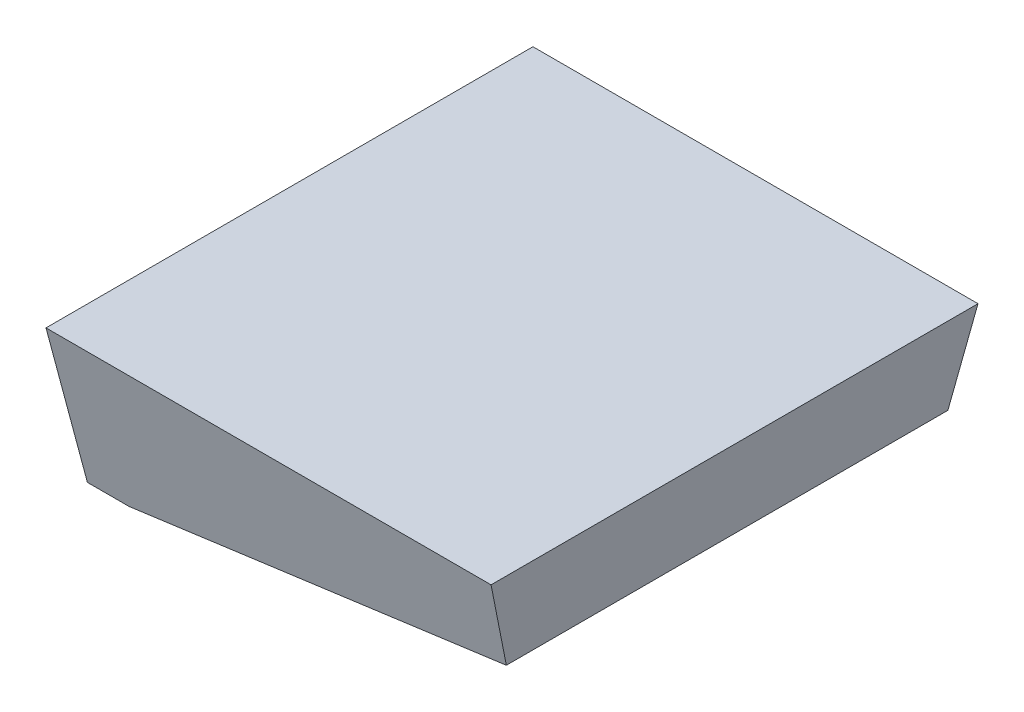
ISO-10303-21;
HEADER;
FILE_DESCRIPTION(('STEP AP214'),'2;1');
FILE_NAME('part.step','',(''),(''),'','','');
FILE_SCHEMA(('AUTOMOTIVE_DESIGN { 1 0 10303 214 1 1 1 1 }'));
ENDSEC;
DATA;
#1=APPLICATION_CONTEXT('core data for automotive mechanical design processes');
#2=APPLICATION_PROTOCOL_DEFINITION('international standard','automotive_design',2000,#1);
#3=PRODUCT_CONTEXT('',#1,'mechanical');
#4=PRODUCT('Part','Part','',(#3));
#5=PRODUCT_RELATED_PRODUCT_CATEGORY('part','',(#4));
#6=PRODUCT_DEFINITION_FORMATION('','',#4);
#7=PRODUCT_DEFINITION_CONTEXT('part definition',#1,'design');
#8=PRODUCT_DEFINITION('design','',#6,#7);
#9=PRODUCT_DEFINITION_SHAPE('','',#8);
#10=(LENGTH_UNIT() NAMED_UNIT(*) SI_UNIT(.MILLI.,.METRE.));
#11=(NAMED_UNIT(*) PLANE_ANGLE_UNIT() SI_UNIT($,.RADIAN.));
#12=(NAMED_UNIT(*) SI_UNIT($,.STERADIAN.) SOLID_ANGLE_UNIT());
#13=UNCERTAINTY_MEASURE_WITH_UNIT(LENGTH_MEASURE(1.E-05),#10,'distance_accuracy_value','');
#14=(GEOMETRIC_REPRESENTATION_CONTEXT(3) GLOBAL_UNCERTAINTY_ASSIGNED_CONTEXT((#13)) GLOBAL_UNIT_ASSIGNED_CONTEXT((#10,
#11,#12)) REPRESENTATION_CONTEXT('',''));
#15=CARTESIAN_POINT('',(0.,0.,0.));
#16=DIRECTION('',(0.,0.,1.));
#17=DIRECTION('',(1.,0.,0.));
#18=AXIS2_PLACEMENT_3D('',#15,#16,#17);
#19=CARTESIAN_POINT('',(0.,0.28184473248759,0.));
#20=DIRECTION('',(0.,1.,0.));
#21=DIRECTION('',(0.,0.,1.));
#22=AXIS2_PLACEMENT_3D('',#19,#20,#21);
#23=PLANE('',#22);
#24=DIRECTION('',(0.,0.,-1.));
#25=VECTOR('',#24,1.);
#26=CARTESIAN_POINT('',(-1.207999997,0.281844732487591,-1.595999983));
#27=LINE('',#26,#25);
#28=CARTESIAN_POINT('',(-1.207999997,0.281844732487591,0.444020093461017));
#29=VERTEX_POINT('',#28);
#30=CARTESIAN_POINT('',(-1.207999997,0.281844732487591,-0.444020093461016));
#31=VERTEX_POINT('',#30);
#32=EDGE_CURVE('E62',#29,#31,#27,.T.);
#33=ORIENTED_EDGE('',*,*,#32,.F.);
#34=DIRECTION('',(-1.,0.,0.));
#35=VECTOR('',#34,1.);
#36=CARTESIAN_POINT('',(39.3804208555364,0.28184473248759,0.444020093461016));
#37=LINE('',#36,#35);
#38=CARTESIAN_POINT('',(-0.396341828032839,0.28184473248759,0.444020093461014));
#39=VERTEX_POINT('',#38);
#40=EDGE_CURVE('E55',#39,#29,#37,.T.);
#41=ORIENTED_EDGE('',*,*,#40,.F.);
#42=DIRECTION('',(0.,0.,-1.));
#43=VECTOR('',#42,1.);
#44=CARTESIAN_POINT('',(-0.396341828032839,0.28184473248759,39.1550244075431));
#45=LINE('',#44,#43);
#46=CARTESIAN_POINT('',(-0.396341828032839,0.28184473248759,-0.444020093461014));
#47=VERTEX_POINT('',#46);
#48=EDGE_CURVE('E12',#39,#47,#45,.T.);
#49=ORIENTED_EDGE('',*,*,#48,.T.);
#50=DIRECTION('',(1.,0.,0.));
#51=VECTOR('',#50,1.);
#52=CARTESIAN_POINT('',(39.3804208555364,0.28184473248759,-0.444020093461016));
#53=LINE('',#52,#51);
#54=EDGE_CURVE('E98',#31,#47,#53,.T.);
#55=ORIENTED_EDGE('',*,*,#54,.F.);
#56=EDGE_LOOP('',(#33,#41,#49,#55));
#57=FACE_BOUND('',#56,.T.);
#58=ADVANCED_FACE('F40',(#57),#23,.T.);
#59=CARTESIAN_POINT('',(-1.207999997,29.999999944,-1.595999983));
#60=DIRECTION('',(-1.,0.,0.));
#61=DIRECTION('',(0.,0.,1.));
#62=AXIS2_PLACEMENT_3D('',#59,#60,#61);
#63=PLANE('',#62);
#64=DIRECTION('',(0.,0.965925826289068,0.258819045102522));
#65=VECTOR('',#64,1.);
#66=CARTESIAN_POINT('',(-1.207999997,27.4992560025178,7.73690346333139));
#67=LINE('',#66,#65);
#68=CARTESIAN_POINT('',(-1.207999997,0.,0.368500025));
#69=VERTEX_POINT('',#68);
#70=EDGE_CURVE('E122',#69,#29,#67,.T.);
#71=ORIENTED_EDGE('',*,*,#70,.T.);
#72=ORIENTED_EDGE('',*,*,#32,.T.);
#73=DIRECTION('',(0.,-0.965925826289068,0.258819045102522));
#74=VECTOR('',#73,1.);
#75=CARTESIAN_POINT('',(-1.207999997,28.2972559940179,-7.95072691661386));
#76=LINE('',#75,#74);
#77=CARTESIAN_POINT('',(-1.207999997,0.,-0.368500025));
#78=VERTEX_POINT('',#77);
#79=EDGE_CURVE('E95',#31,#78,#76,.T.);
#80=ORIENTED_EDGE('',*,*,#79,.T.);
#81=DIRECTION('',(0.,0.,1.));
#82=VECTOR('',#81,1.);
#83=CARTESIAN_POINT('',(-1.207999997,0.,0.));
#84=LINE('',#83,#82);
#85=EDGE_CURVE('E119',#78,#69,#84,.T.);
#86=ORIENTED_EDGE('',*,*,#85,.T.);
#87=EDGE_LOOP('',(#71,#72,#80,#86));
#88=FACE_BOUND('',#87,.T.);
#89=ADVANCED_FACE('F130',(#88),#63,.T.);
#90=CARTESIAN_POINT('',(39.3804208555364,0.,0.368500025));
#91=DIRECTION('',(0.,-0.258819045102522,0.965925826289068));
#92=DIRECTION('',(0.,-0.965925826289068,-0.258819045102522));
#93=AXIS2_PLACEMENT_3D('',#90,#91,#92);
#94=PLANE('',#93);
#95=DIRECTION('',(-0.0842074097641779,-0.962495097884607,-0.257899784197096));
#96=VECTOR('',#95,1.);
#97=CARTESIAN_POINT('',(-0.138772634743607,3.22587408336354,1.23287038052175));
#98=LINE('',#97,#96);
#99=CARTESIAN_POINT('',(-0.409863005221876,0.127296970021989,0.402609145316321));
#100=VERTEX_POINT('',#99);
#101=EDGE_CURVE('E110',#39,#100,#98,.T.);
#102=ORIENTED_EDGE('',*,*,#101,.F.);
#103=ORIENTED_EDGE('',*,*,#40,.T.);
#104=ORIENTED_EDGE('',*,*,#70,.F.);
#105=DIRECTION('',(-1.,0.,0.));
#106=VECTOR('',#105,1.);
#107=CARTESIAN_POINT('',(39.3804208555364,0.,0.368500025));
#108=LINE('',#107,#106);
#109=CARTESIAN_POINT('',(-1.13179999699999,0.,0.368500025));
#110=VERTEX_POINT('',#109);
#111=EDGE_CURVE('E115',#110,#69,#108,.T.);
#112=ORIENTED_EDGE('',*,*,#111,.F.);
#113=DIRECTION('',(-0.983743457179398,-0.173460513596151,-0.0464786045367767));
#114=VECTOR('',#113,1.);
#115=CARTESIAN_POINT('',(38.0739499240819,6.91303150999555,2.22084123535422));
#116=LINE('',#115,#114);
#117=EDGE_CURVE('E112',#100,#110,#116,.T.);
#118=ORIENTED_EDGE('',*,*,#117,.F.);
#119=EDGE_LOOP('',(#102,#103,#104,#112,#118));
#120=FACE_BOUND('',#119,.T.);
#121=ADVANCED_FACE('F131',(#120),#94,.T.);
#122=CARTESIAN_POINT('',(39.3804208555364,0.,-0.368500025));
#123=DIRECTION('',(0.,-0.258819045102522,-0.965925826289068));
#124=DIRECTION('',(0.,0.965925826289068,-0.258819045102522));
#125=AXIS2_PLACEMENT_3D('',#122,#123,#124);
#126=PLANE('',#125);
#127=ORIENTED_EDGE('',*,*,#79,.F.);
#128=ORIENTED_EDGE('',*,*,#54,.T.);
#129=DIRECTION('',(0.0842074097641779,0.962495097884607,-0.257899784197096));
#130=VECTOR('',#129,1.);
#131=CARTESIAN_POINT('',(-0.138772634743607,3.22587408336354,-1.23287038052175));
#132=LINE('',#131,#130);
#133=CARTESIAN_POINT('',(-0.409863005221876,0.127296970021989,-0.402609145316321));
#134=VERTEX_POINT('',#133);
#135=EDGE_CURVE('E88',#134,#47,#132,.T.);
#136=ORIENTED_EDGE('',*,*,#135,.F.);
#137=DIRECTION('',(0.983743457179398,0.173460513596151,-0.0464786045367767));
#138=VECTOR('',#137,1.);
#139=CARTESIAN_POINT('',(38.0739499240819,6.91303150999555,-2.22084123535422));
#140=LINE('',#139,#138);
#141=CARTESIAN_POINT('',(-1.13179999699999,0.,-0.368500025));
#142=VERTEX_POINT('',#141);
#143=EDGE_CURVE('E48',#142,#134,#140,.T.);
#144=ORIENTED_EDGE('',*,*,#143,.F.);
#145=DIRECTION('',(-1.,0.,0.));
#146=VECTOR('',#145,1.);
#147=CARTESIAN_POINT('',(39.3804208555364,0.,-0.368500025));
#148=LINE('',#147,#146);
#149=EDGE_CURVE('E117',#142,#78,#148,.T.);
#150=ORIENTED_EDGE('',*,*,#149,.T.);
#151=EDGE_LOOP('',(#127,#128,#136,#144,#150));
#152=FACE_BOUND('',#151,.T.);
#153=ADVANCED_FACE('F99',(#152),#126,.T.);
#154=CARTESIAN_POINT('',(-0.409863005221876,0.127296970021989,39.1550244075431));
#155=DIRECTION('',(-0.996194698091746,0.0871557427476584,0.));
#156=DIRECTION('',(-0.0871557427476584,-0.996194698091746,0.));
#157=AXIS2_PLACEMENT_3D('',#154,#155,#156);
#158=PLANE('',#157);
#159=ORIENTED_EDGE('',*,*,#48,.F.);
#160=ORIENTED_EDGE('',*,*,#101,.T.);
#161=DIRECTION('',(0.,0.,-1.));
#162=VECTOR('',#161,1.);
#163=CARTESIAN_POINT('',(-0.409863005221876,0.127296970021989,39.1550244075431));
#164=LINE('',#163,#162);
#165=EDGE_CURVE('E92',#100,#134,#164,.T.);
#166=ORIENTED_EDGE('',*,*,#165,.T.);
#167=ORIENTED_EDGE('',*,*,#135,.T.);
#168=EDGE_LOOP('',(#159,#160,#166,#167));
#169=FACE_BOUND('',#168,.T.);
#170=ADVANCED_FACE('F90',(#169),#158,.F.);
#171=CARTESIAN_POINT('',(0.,0.,0.));
#172=DIRECTION('',(0.,1.,0.));
#173=DIRECTION('',(0.,0.,1.));
#174=AXIS2_PLACEMENT_3D('',#171,#172,#173);
#175=PLANE('',#174);
#176=DIRECTION('',(0.,0.,-1.));
#177=VECTOR('',#176,1.);
#178=CARTESIAN_POINT('',(-1.131799997,0.,39.1550244075431));
#179=LINE('',#178,#177);
#180=EDGE_CURVE('E107',#110,#142,#179,.T.);
#181=ORIENTED_EDGE('',*,*,#180,.F.);
#182=ORIENTED_EDGE('',*,*,#111,.T.);
#183=ORIENTED_EDGE('',*,*,#85,.F.);
#184=ORIENTED_EDGE('',*,*,#149,.F.);
#185=EDGE_LOOP('',(#181,#182,#183,#184));
#186=FACE_BOUND('',#185,.T.);
#187=ADVANCED_FACE('F42',(#186),#175,.F.);
#188=CARTESIAN_POINT('',(-1.131799997,0.,39.1550244075431));
#189=DIRECTION('',(-0.173648177666931,0.984807753012208,0.));
#190=DIRECTION('',(-0.984807753012208,-0.173648177666931,0.));
#191=AXIS2_PLACEMENT_3D('',#188,#189,#190);
#192=PLANE('',#191);
#193=ORIENTED_EDGE('',*,*,#165,.F.);
#194=ORIENTED_EDGE('',*,*,#117,.T.);
#195=ORIENTED_EDGE('',*,*,#180,.T.);
#196=ORIENTED_EDGE('',*,*,#143,.T.);
#197=EDGE_LOOP('',(#193,#194,#195,#196));
#198=FACE_BOUND('',#197,.T.);
#199=ADVANCED_FACE('F125',(#198),#192,.F.);
#200=CLOSED_SHELL('',(#58,#89,#121,#153,#170,#187,#199));
#201=MANIFOLD_SOLID_BREP('B2',#200);
#202=ADVANCED_BREP_SHAPE_REPRESENTATION('',(#18,#201),#14);
#203=SHAPE_DEFINITION_REPRESENTATION(#9,#202);
ENDSEC;
END-ISO-10303-21;
